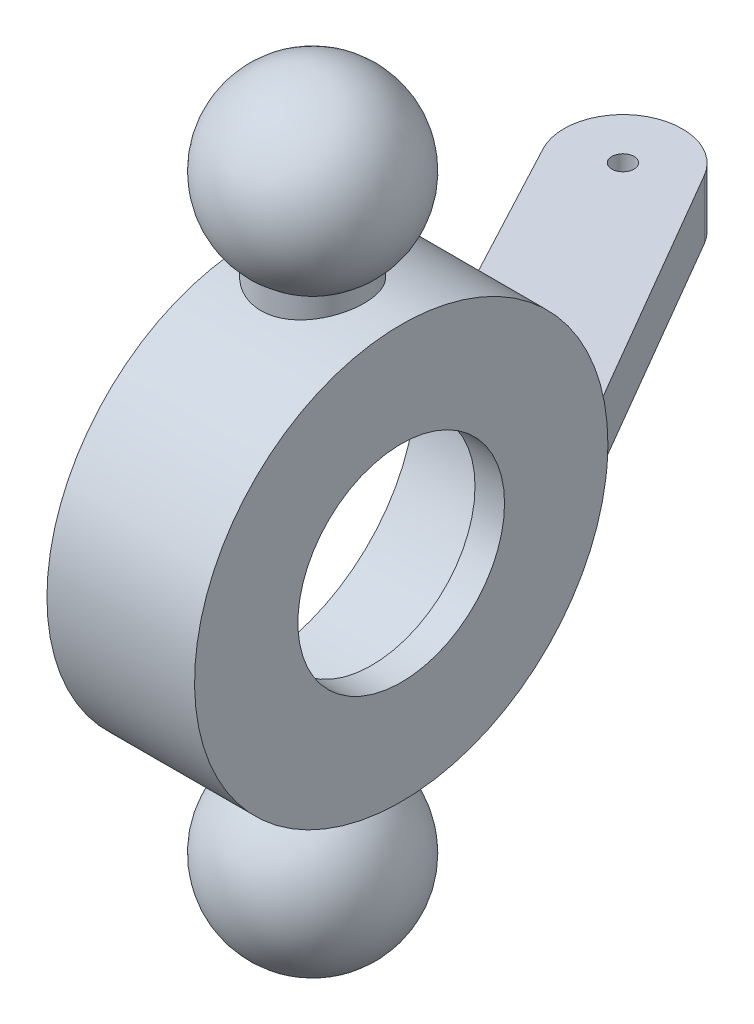
ISO-10303-21;
HEADER;
FILE_DESCRIPTION(('STEP AP214'),'2;1');
FILE_NAME('part.step','',(''),(''),'','','');
FILE_SCHEMA(('AUTOMOTIVE_DESIGN { 1 0 10303 214 1 1 1 1 }'));
ENDSEC;
DATA;
#1=APPLICATION_CONTEXT('core data for automotive mechanical design processes');
#2=APPLICATION_PROTOCOL_DEFINITION('international standard','automotive_design',2000,#1);
#3=PRODUCT_CONTEXT('',#1,'mechanical');
#4=PRODUCT('Part','Part','',(#3));
#5=PRODUCT_RELATED_PRODUCT_CATEGORY('part','',(#4));
#6=PRODUCT_DEFINITION_FORMATION('','',#4);
#7=PRODUCT_DEFINITION_CONTEXT('part definition',#1,'design');
#8=PRODUCT_DEFINITION('design','',#6,#7);
#9=PRODUCT_DEFINITION_SHAPE('','',#8);
#10=(LENGTH_UNIT() NAMED_UNIT(*) SI_UNIT(.MILLI.,.METRE.));
#11=(NAMED_UNIT(*) PLANE_ANGLE_UNIT() SI_UNIT($,.RADIAN.));
#12=(NAMED_UNIT(*) SI_UNIT($,.STERADIAN.) SOLID_ANGLE_UNIT());
#13=UNCERTAINTY_MEASURE_WITH_UNIT(LENGTH_MEASURE(1.E-05),#10,'distance_accuracy_value','');
#14=(GEOMETRIC_REPRESENTATION_CONTEXT(3) GLOBAL_UNCERTAINTY_ASSIGNED_CONTEXT((#13)) GLOBAL_UNIT_ASSIGNED_CONTEXT((#10,
#11,#12)) REPRESENTATION_CONTEXT('',''));
#15=CARTESIAN_POINT('',(0.,0.,0.));
#16=DIRECTION('',(0.,0.,1.));
#17=DIRECTION('',(1.,0.,0.));
#18=AXIS2_PLACEMENT_3D('',#15,#16,#17);
#19=CARTESIAN_POINT('',(0.,0.,0.));
#20=DIRECTION('',(1.,0.,0.));
#21=DIRECTION('',(0.,0.,-1.));
#22=AXIS2_PLACEMENT_3D('',#19,#20,#21);
#23=PLANE('',#22);
#24=CARTESIAN_POINT('',(0.,0.,0.));
#25=DIRECTION('',(1.,0.,0.));
#26=DIRECTION('',(0.,0.,-1.));
#27=AXIS2_PLACEMENT_3D('',#24,#25,#26);
#28=CIRCLE('',#27,11.);
#29=CARTESIAN_POINT('',(0.,0.,-11.));
#30=VERTEX_POINT('',#29);
#31=EDGE_CURVE('E174',#30,#30,#28,.T.);
#32=ORIENTED_EDGE('',*,*,#31,.T.);
#33=EDGE_LOOP('',(#32));
#34=FACE_BOUND('',#33,.T.);
#35=DIRECTION('',(0.,0.,1.));
#36=VECTOR('',#35,1.);
#37=CARTESIAN_POINT('',(0.,-2.,0.));
#38=LINE('',#37,#36);
#39=CARTESIAN_POINT('',(0.,-2.,-13.856406460551));
#40=VERTEX_POINT('',#39);
#41=CARTESIAN_POINT('',(0.,-2.,-13.));
#42=VERTEX_POINT('',#41);
#43=EDGE_CURVE('E157',#40,#42,#38,.T.);
#44=ORIENTED_EDGE('',*,*,#43,.F.);
#45=CARTESIAN_POINT('',(0.,0.,0.));
#46=DIRECTION('',(1.,0.,0.));
#47=DIRECTION('',(0.,0.,-1.));
#48=AXIS2_PLACEMENT_3D('',#45,#46,#47);
#49=CIRCLE('',#48,14.);
#50=CARTESIAN_POINT('',(0.,2.,-13.856406460551));
#51=VERTEX_POINT('',#50);
#52=EDGE_CURVE('E177',#51,#40,#49,.T.);
#53=ORIENTED_EDGE('',*,*,#52,.F.);
#54=DIRECTION('',(0.,0.,1.));
#55=VECTOR('',#54,1.);
#56=CARTESIAN_POINT('',(0.,2.,0.));
#57=LINE('',#56,#55);
#58=CARTESIAN_POINT('',(0.,2.,-13.));
#59=VERTEX_POINT('',#58);
#60=EDGE_CURVE('E55',#51,#59,#57,.T.);
#61=ORIENTED_EDGE('',*,*,#60,.T.);
#62=DIRECTION('',(0.,1.,0.));
#63=VECTOR('',#62,1.);
#64=CARTESIAN_POINT('',(0.,-2.,-13.));
#65=LINE('',#64,#63);
#66=EDGE_CURVE('E147',#42,#59,#65,.T.);
#67=ORIENTED_EDGE('',*,*,#66,.F.);
#68=EDGE_LOOP('',(#44,#53,#61,#67));
#69=FACE_BOUND('',#68,.T.);
#70=ADVANCED_FACE('F39',(#34,#69),#23,.F.);
#71=CARTESIAN_POINT('',(8.,0.,0.));
#72=DIRECTION('',(-1.,0.,0.));
#73=DIRECTION('',(0.,0.,1.));
#74=AXIS2_PLACEMENT_3D('',#71,#72,#73);
#75=CYLINDRICAL_SURFACE('',#74,14.);
#76=CARTESIAN_POINT('',(10.,0.,0.));
#77=DIRECTION('',(1.,0.,0.));
#78=DIRECTION('',(0.,0.,-1.));
#79=AXIS2_PLACEMENT_3D('',#76,#77,#78);
#80=CIRCLE('',#79,14.);
#81=CARTESIAN_POINT('',(10.,0.,-14.));
#82=VERTEX_POINT('',#81);
#83=EDGE_CURVE('E165',#82,#82,#80,.T.);
#84=ORIENTED_EDGE('',*,*,#83,.F.);
#85=EDGE_LOOP('',(#84));
#86=FACE_BOUND('',#85,.T.);
#87=CARTESIAN_POINT('',(4.,13.555441711726,-3.5));
#88=CARTESIAN_POINT('',(4.19327105129721,13.55544540123,-3.4999945100303));
#89=CARTESIAN_POINT('',(4.38660285814993,13.5596202842044,-3.48393674369671));
#90=CARTESIAN_POINT('',(4.76771460944291,13.5758260678959,-3.42023237564931));
#91=CARTESIAN_POINT('',(4.95549125625546,13.5878615407028,-3.37256738943895));
#92=CARTESIAN_POINT('',(5.31992495346205,13.6183421443461,-3.24728767948486));
#93=CARTESIAN_POINT('',(5.49659601753999,13.6367789976664,-3.16971161899629));
#94=CARTESIAN_POINT('',(5.83443519355584,13.6779746884026,-2.98692959776594));
#95=CARTESIAN_POINT('',(5.9956026469123,13.7007337092988,-2.88172246398496));
#96=CARTESIAN_POINT('',(6.3014063033671,13.7485700289787,-2.64419179823663));
#97=CARTESIAN_POINT('',(6.44565104049007,13.7736843667225,-2.51137164278567));
#98=CARTESIAN_POINT('',(6.71006595210447,13.8230802572141,-2.22345488974093));
#99=CARTESIAN_POINT('',(6.83023387587045,13.8473617319294,-2.06835621185243));
#100=CARTESIAN_POINT('',(7.04468565468379,13.8927658172882,-1.73760328151054));
#101=CARTESIAN_POINT('',(7.13858494342605,13.9138396236083,-1.56169240667317));
#102=CARTESIAN_POINT('',(7.29533350181432,13.9500313669638,-1.19596845800987));
#103=CARTESIAN_POINT('',(7.35818735268172,13.9651501826808,-1.00615744010872));
#104=CARTESIAN_POINT('',(7.44980696841002,13.9874666238745,-0.622102262255826));
#105=CARTESIAN_POINT('',(7.47923750205722,13.9948185138204,-0.428025807368566));
#106=CARTESIAN_POINT('',(7.50526173098577,14.0013103175022,-0.0375603469678757));
#107=CARTESIAN_POINT('',(7.50186028109343,14.000451445354,0.1588283123533));
#108=CARTESIAN_POINT('',(7.46279520964981,13.9907333293494,0.543732865103353));
#109=CARTESIAN_POINT('',(7.42784914492463,13.9820520327718,0.732326754603721));
#110=CARTESIAN_POINT('',(7.32784022193207,13.9578717113484,1.10088386594792));
#111=CARTESIAN_POINT('',(7.26277576047152,13.9423723235797,1.28084662779658));
#112=CARTESIAN_POINT('',(7.10379640103822,13.906025135811,1.62892346225627));
#113=CARTESIAN_POINT('',(7.00962613747395,13.8851302757249,1.79691578418258));
#114=CARTESIAN_POINT('',(6.79530204923684,13.8402586533409,2.1149646781919));
#115=CARTESIAN_POINT('',(6.67514370401366,13.8162813551566,2.26501812279998));
#116=CARTESIAN_POINT('',(6.40840776122619,13.767091992751,2.54720912279662));
#117=CARTESIAN_POINT('',(6.26120315071884,13.7418640732785,2.67875187676046));
#118=CARTESIAN_POINT('',(5.94656003703793,13.6936106093183,2.91541731587331));
#119=CARTESIAN_POINT('',(5.77912058869123,13.6705851677987,3.0205387661713));
#120=CARTESIAN_POINT('',(5.42759395220805,13.6292869553258,3.20175845157131));
#121=CARTESIAN_POINT('',(5.24342997763167,13.6110377709745,3.27771348436242));
#122=CARTESIAN_POINT('',(4.86438034476488,13.5816609610198,3.39739967219245));
#123=CARTESIAN_POINT('',(4.66949699044373,13.5705318115174,3.44113772292637));
#124=CARTESIAN_POINT('',(4.28005669784264,13.5569749843781,3.49416149414056));
#125=CARTESIAN_POINT('',(4.08562708931842,13.5543252457504,3.50432666348898));
#126=CARTESIAN_POINT('',(3.69784928878479,13.5574228070324,3.49232378671901));
#127=CARTESIAN_POINT('',(3.50450099887188,13.5631693339647,3.47015871698913));
#128=CARTESIAN_POINT('',(3.12764002907091,13.5821991478089,3.39489564951413));
#129=CARTESIAN_POINT('',(2.94401818280283,13.5953575834006,3.34230969559482));
#130=CARTESIAN_POINT('',(2.58819595900563,13.6276100556741,3.20826531433849));
#131=CARTESIAN_POINT('',(2.41599693732198,13.6467047954483,3.12680346679746));
#132=CARTESIAN_POINT('',(2.08418221098627,13.6891459193386,2.93547893511128));
#133=CARTESIAN_POINT('',(1.92487962393981,13.7125683605018,2.82509045536991));
#134=CARTESIAN_POINT('',(1.62673629207796,13.7608391629952,2.57971102527057));
#135=CARTESIAN_POINT('',(1.48789891668986,13.7856877581962,2.44471603181903));
#136=CARTESIAN_POINT('',(1.2310645404007,13.8347636424449,2.14991952344655));
#137=CARTESIAN_POINT('',(1.11367591243167,13.8589598288664,1.98958183386058));
#138=CARTESIAN_POINT('',(0.907489786268248,13.9033610325916,1.65095938943136));
#139=CARTESIAN_POINT('',(0.818690796748509,13.9235662580553,1.47267557135157));
#140=CARTESIAN_POINT('',(0.672975551660898,13.9575816203366,1.10445370605882));
#141=CARTESIAN_POINT('',(0.61583000186931,13.9714376203137,0.914610833597587));
#142=CARTESIAN_POINT('',(0.53435553154822,13.991394107541,0.527624161115824));
#143=CARTESIAN_POINT('',(0.510020277765346,13.9974960915079,0.330481777644342));
#144=CARTESIAN_POINT('',(0.495213436485614,14.0011959293082,-0.0597923425516314));
#145=CARTESIAN_POINT('',(0.503844018166072,13.9990192607996,-0.252888394381077));
#146=CARTESIAN_POINT('',(0.552667395530223,13.9869063760105,-0.634786237451629));
#147=CARTESIAN_POINT('',(0.592859252546092,13.9769703905009,-0.823588156233251));
#148=CARTESIAN_POINT('',(0.703182769198015,13.9504901498861,-1.19059862475671));
#149=CARTESIAN_POINT('',(0.773152086600326,13.9339817575837,-1.36885873103302));
#150=CARTESIAN_POINT('',(0.940897026568503,13.896095111978,-1.71120968564569));
#151=CARTESIAN_POINT('',(1.0386761543467,13.8747162448565,-1.87529874442972));
#152=CARTESIAN_POINT('',(1.26200331898647,13.82875373881,-2.18890674948156));
#153=CARTESIAN_POINT('',(1.3881605001634,13.8041055929583,-2.33798245904417));
#154=CARTESIAN_POINT('',(1.66347998192072,13.7546727170016,-2.61315257095726));
#155=CARTESIAN_POINT('',(1.81264810638907,13.7298879538556,-2.73924113776807));
#156=CARTESIAN_POINT('',(2.13310494966311,13.6824616545926,-2.96716709265141));
#157=CARTESIAN_POINT('',(2.30475443177839,13.6598687285651,-3.06850816795732));
#158=CARTESIAN_POINT('',(2.66319421456187,13.620038442319,-3.24074413804914));
#159=CARTESIAN_POINT('',(2.84997338132846,13.6027971881625,-3.31166118413253));
#160=CARTESIAN_POINT('',(3.19701954142306,13.5783168062758,-3.41047884999851));
#161=CARTESIAN_POINT('',(3.35562607535148,13.5698032051225,-3.44397609708907));
#162=CARTESIAN_POINT('',(3.67614104149191,13.5583643503917,-3.48873802400119));
#163=CARTESIAN_POINT('',(3.83804919085541,13.5554386201188,-3.50000460030113));
#164=CARTESIAN_POINT('',(4.,13.555441711726,-3.5));
#165=B_SPLINE_CURVE_WITH_KNOTS('',3,(#87,#88,#89,#90,#91,#92,#93,#94,#95,#96,#97,#98,#99,#100,
#101,#102,#103,#104,#105,#106,#107,#108,#109,#110,#111,#112,#113,#114,#115,#116,#117,#118,#119,
#120,#121,#122,#123,#124,#125,#126,#127,#128,#129,#130,#131,#132,#133,#134,#135,#136,#137,#138,
#139,#140,#141,#142,#143,#144,#145,#146,#147,#148,#149,#150,#151,#152,#153,#154,#155,#156,#157,
#158,#159,#160,#161,#162,#163,#164),.UNSPECIFIED.,.T.,.F.,(4,2,2,2,2,2,2,2,2,2,2,2,2,2,2,2,2,2,
2,2,2,2,2,2,2,2,2,2,2,2,2,2,2,2,2,2,2,2,4),(0.,0.579218418430591,1.15877403800013,
1.73758301803243,2.3164165745767,2.90673535870167,3.49710930071813,4.09572094957088,
4.69424423785929,5.28064251393485,5.86695408132429,6.44025567764526,7.013587794147,
7.59210023956222,8.17071339656479,8.76498653200676,9.35928743679723,9.95647004813416,
10.5535248018492,11.1348100467344,11.716041780678,12.2877636702336,12.8595533000046,
13.4425598421329,14.0256622644954,14.6233546336192,15.2210158201785,15.8142890194017,
16.4074476848313,16.9845682458891,17.5616716433825,18.1356682719407,18.7097372804377,
19.2975593522537,19.8855304420219,20.4844706821114,21.0829740992857,21.5683695806357,
22.0537236515463),.UNSPECIFIED.);
#166=CARTESIAN_POINT('',(4.,13.555441711726,-3.5));
#167=VERTEX_POINT('',#166);
#168=EDGE_CURVE('E178',#167,#167,#165,.T.);
#169=ORIENTED_EDGE('',*,*,#168,.T.);
#170=EDGE_LOOP('',(#169));
#171=FACE_BOUND('',#170,.T.);
#172=CARTESIAN_POINT('',(4.,-13.555441711726,-3.5));
#173=CARTESIAN_POINT('',(3.80672894870279,-13.55544540123,-3.4999945100303));
#174=CARTESIAN_POINT('',(3.61339714185007,-13.5596202842044,-3.48393674369671));
#175=CARTESIAN_POINT('',(3.23228539055709,-13.5758260678959,-3.42023237564931));
#176=CARTESIAN_POINT('',(3.04450874374454,-13.5878615407028,-3.37256738943895));
#177=CARTESIAN_POINT('',(2.68007504653795,-13.6183421443461,-3.24728767948486));
#178=CARTESIAN_POINT('',(2.50340398246001,-13.6367789976664,-3.16971161899629));
#179=CARTESIAN_POINT('',(2.16556480644417,-13.6779746884026,-2.98692959776594));
#180=CARTESIAN_POINT('',(2.0043973530877,-13.7007337092988,-2.88172246398496));
#181=CARTESIAN_POINT('',(1.6985936966329,-13.7485700289787,-2.64419179823663));
#182=CARTESIAN_POINT('',(1.55434895950993,-13.7736843667225,-2.51137164278567));
#183=CARTESIAN_POINT('',(1.28993404789553,-13.8230802572141,-2.22345488974093));
#184=CARTESIAN_POINT('',(1.16976612412955,-13.8473617319294,-2.06835621185243));
#185=CARTESIAN_POINT('',(0.955314345316211,-13.8927658172882,-1.73760328151054));
#186=CARTESIAN_POINT('',(0.861415056573948,-13.9138396236083,-1.56169240667317));
#187=CARTESIAN_POINT('',(0.704666498185684,-13.9500313669638,-1.19596845800987));
#188=CARTESIAN_POINT('',(0.64181264731828,-13.9651501826808,-1.00615744010872));
#189=CARTESIAN_POINT('',(0.55019303158998,-13.9874666238745,-0.622102262255827));
#190=CARTESIAN_POINT('',(0.520762497942783,-13.9948185138204,-0.428025807368567));
#191=CARTESIAN_POINT('',(0.494738269014228,-14.0013103175022,-0.0375603469678764));
#192=CARTESIAN_POINT('',(0.498139718906569,-14.000451445354,0.158828312353299));
#193=CARTESIAN_POINT('',(0.537204790350194,-13.9907333293494,0.543732865103351));
#194=CARTESIAN_POINT('',(0.572150855075371,-13.9820520327718,0.73232675460372));
#195=CARTESIAN_POINT('',(0.672159778067927,-13.9578717113484,1.10088386594791));
#196=CARTESIAN_POINT('',(0.737224239528477,-13.9423723235797,1.28084662779658));
#197=CARTESIAN_POINT('',(0.896203598961785,-13.906025135811,1.62892346225627));
#198=CARTESIAN_POINT('',(0.99037386252605,-13.8851302757249,1.79691578418258));
#199=CARTESIAN_POINT('',(1.20469795076316,-13.8402586533409,2.1149646781919));
#200=CARTESIAN_POINT('',(1.32485629598634,-13.8162813551566,2.26501812279997));
#201=CARTESIAN_POINT('',(1.59159223877381,-13.767091992751,2.54720912279662));
#202=CARTESIAN_POINT('',(1.73879684928116,-13.7418640732785,2.67875187676045));
#203=CARTESIAN_POINT('',(2.05343996296207,-13.6936106093183,2.91541731587331));
#204=CARTESIAN_POINT('',(2.22087941130877,-13.6705851677987,3.0205387661713));
#205=CARTESIAN_POINT('',(2.57240604779195,-13.6292869553258,3.20175845157131));
#206=CARTESIAN_POINT('',(2.75657002236833,-13.6110377709745,3.27771348436242));
#207=CARTESIAN_POINT('',(3.13561965523512,-13.5816609610198,3.39739967219245));
#208=CARTESIAN_POINT('',(3.33050300955627,-13.5705318115174,3.44113772292637));
#209=CARTESIAN_POINT('',(3.71994330215736,-13.5569749843781,3.49416149414056));
#210=CARTESIAN_POINT('',(3.91437291068158,-13.5543252457504,3.50432666348898));
#211=CARTESIAN_POINT('',(4.30215071121521,-13.5574228070324,3.49232378671901));
#212=CARTESIAN_POINT('',(4.49549900112812,-13.5631693339647,3.47015871698913));
#213=CARTESIAN_POINT('',(4.87235997092909,-13.5821991478089,3.39489564951413));
#214=CARTESIAN_POINT('',(5.05598181719717,-13.5953575834006,3.34230969559482));
#215=CARTESIAN_POINT('',(5.41180404099437,-13.6276100556741,3.20826531433849));
#216=CARTESIAN_POINT('',(5.58400306267802,-13.6467047954483,3.12680346679746));
#217=CARTESIAN_POINT('',(5.91581778901373,-13.6891459193386,2.93547893511128));
#218=CARTESIAN_POINT('',(6.07512037606019,-13.7125683605018,2.82509045536991));
#219=CARTESIAN_POINT('',(6.37326370792204,-13.7608391629952,2.57971102527057));
#220=CARTESIAN_POINT('',(6.51210108331014,-13.7856877581962,2.44471603181903));
#221=CARTESIAN_POINT('',(6.7689354595993,-13.8347636424449,2.14991952344655));
#222=CARTESIAN_POINT('',(6.88632408756833,-13.8589598288664,1.98958183386058));
#223=CARTESIAN_POINT('',(7.09251021373175,-13.9033610325916,1.65095938943136));
#224=CARTESIAN_POINT('',(7.18130920325149,-13.9235662580553,1.47267557135157));
#225=CARTESIAN_POINT('',(7.3270244483391,-13.9575816203366,1.10445370605882));
#226=CARTESIAN_POINT('',(7.38416999813069,-13.9714376203137,0.914610833597587));
#227=CARTESIAN_POINT('',(7.46564446845178,-13.991394107541,0.527624161115824));
#228=CARTESIAN_POINT('',(7.48997972223465,-13.9974960915079,0.330481777644341));
#229=CARTESIAN_POINT('',(7.50478656351439,-14.0011959293082,-0.0597923425516321));
#230=CARTESIAN_POINT('',(7.49615598183393,-13.9990192607996,-0.252888394381078));
#231=CARTESIAN_POINT('',(7.44733260446978,-13.9869063760105,-0.63478623745163));
#232=CARTESIAN_POINT('',(7.40714074745391,-13.9769703905009,-0.823588156233251));
#233=CARTESIAN_POINT('',(7.29681723080198,-13.9504901498861,-1.19059862475671));
#234=CARTESIAN_POINT('',(7.22684791339967,-13.9339817575837,-1.36885873103302));
#235=CARTESIAN_POINT('',(7.0591029734315,-13.896095111978,-1.71120968564569));
#236=CARTESIAN_POINT('',(6.9613238456533,-13.8747162448565,-1.87529874442972));
#237=CARTESIAN_POINT('',(6.73799668101353,-13.82875373881,-2.18890674948156));
#238=CARTESIAN_POINT('',(6.61183949983659,-13.8041055929583,-2.33798245904417));
#239=CARTESIAN_POINT('',(6.33652001807928,-13.7546727170016,-2.61315257095726));
#240=CARTESIAN_POINT('',(6.18735189361093,-13.7298879538556,-2.73924113776807));
#241=CARTESIAN_POINT('',(5.86689505033689,-13.6824616545926,-2.96716709265141));
#242=CARTESIAN_POINT('',(5.69524556822161,-13.6598687285651,-3.06850816795733));
#243=CARTESIAN_POINT('',(5.33680578543813,-13.620038442319,-3.24074413804914));
#244=CARTESIAN_POINT('',(5.15002661867154,-13.6027971881625,-3.31166118413253));
#245=CARTESIAN_POINT('',(4.80298045857694,-13.5783168062758,-3.41047884999851));
#246=CARTESIAN_POINT('',(4.64437392464852,-13.5698032051225,-3.44397609708907));
#247=CARTESIAN_POINT('',(4.32385895850809,-13.5583643503917,-3.48873802400119));
#248=CARTESIAN_POINT('',(4.16195080914459,-13.5554386201188,-3.50000460030113));
#249=CARTESIAN_POINT('',(4.,-13.555441711726,-3.5));
#250=B_SPLINE_CURVE_WITH_KNOTS('',3,(#172,#173,#174,#175,#176,#177,#178,#179,#180,#181,#182,
#183,#184,#185,#186,#187,#188,#189,#190,#191,#192,#193,#194,#195,#196,#197,#198,#199,#200,#201,
#202,#203,#204,#205,#206,#207,#208,#209,#210,#211,#212,#213,#214,#215,#216,#217,#218,#219,#220,
#221,#222,#223,#224,#225,#226,#227,#228,#229,#230,#231,#232,#233,#234,#235,#236,#237,#238,#239,
#240,#241,#242,#243,#244,#245,#246,#247,#248,#249),.UNSPECIFIED.,.T.,.F.,(4,2,2,2,2,2,2,2,2,2,2,
2,2,2,2,2,2,2,2,2,2,2,2,2,2,2,2,2,2,2,2,2,2,2,2,2,2,2,4),(0.,0.579218418430591,1.15877403800013,
1.73758301803243,2.3164165745767,2.90673535870167,3.49710930071813,4.09572094957088,
4.69424423785929,5.28064251393485,5.86695408132429,6.44025567764526,7.013587794147,
7.59210023956222,8.17071339656479,8.76498653200676,9.35928743679723,9.95647004813416,
10.5535248018492,11.1348100467344,11.716041780678,12.2877636702336,12.8595533000046,
13.4425598421329,14.0256622644954,14.6233546336192,15.2210158201785,15.8142890194018,
16.4074476848313,16.9845682458891,17.5616716433825,18.1356682719407,18.7097372804378,
19.2975593522537,19.8855304420219,20.4844706821114,21.0829740992857,21.5683695806357,
22.0537236515463),.UNSPECIFIED.);
#251=CARTESIAN_POINT('',(4.,-13.555441711726,-3.5));
#252=VERTEX_POINT('',#251);
#253=EDGE_CURVE('E173',#252,#252,#250,.T.);
#254=ORIENTED_EDGE('',*,*,#253,.T.);
#255=EDGE_LOOP('',(#254));
#256=FACE_BOUND('',#255,.T.);
#257=DIRECTION('',(-1.,0.,0.));
#258=VECTOR('',#257,1.);
#259=CARTESIAN_POINT('',(8.,-2.,-13.856406460551));
#260=LINE('',#259,#258);
#261=CARTESIAN_POINT('',(9.50182028456165,-2.,-13.856406460551));
#262=VERTEX_POINT('',#261);
#263=EDGE_CURVE('E63',#262,#40,#260,.T.);
#264=ORIENTED_EDGE('',*,*,#263,.F.);
#265=CARTESIAN_POINT('',(17.5622226115993,0.,0.));
#266=DIRECTION('',(0.864389195397262,0.,-0.502823347588866));
#267=DIRECTION('',(-0.502823347588866,0.,-0.864389195397262));
#268=AXIS2_PLACEMENT_3D('',#265,#266,#267);
#269=ELLIPSE('',#268,16.1964079080903,14.);
#270=CARTESIAN_POINT('',(9.50182028456165,2.,-13.856406460551));
#271=VERTEX_POINT('',#270);
#272=EDGE_CURVE('E159',#262,#271,#269,.T.);
#273=ORIENTED_EDGE('',*,*,#272,.T.);
#274=DIRECTION('',(-1.,0.,0.));
#275=VECTOR('',#274,1.);
#276=CARTESIAN_POINT('',(8.,2.,-13.856406460551));
#277=LINE('',#276,#275);
#278=EDGE_CURVE('E107',#271,#51,#277,.T.);
#279=ORIENTED_EDGE('',*,*,#278,.T.);
#280=ORIENTED_EDGE('',*,*,#52,.T.);
#281=EDGE_LOOP('',(#264,#273,#279,#280));
#282=FACE_BOUND('',#281,.T.);
#283=ADVANCED_FACE('F41',(#86,#171,#256,#282),#75,.T.);
#284=CARTESIAN_POINT('',(8.,0.,0.));
#285=DIRECTION('',(-1.,0.,0.));
#286=DIRECTION('',(0.,0.,1.));
#287=AXIS2_PLACEMENT_3D('',#284,#285,#286);
#288=CYLINDRICAL_SURFACE('',#287,11.);
#289=CARTESIAN_POINT('',(8.,0.,0.));
#290=DIRECTION('',(1.,0.,0.));
#291=DIRECTION('',(0.,0.,-1.));
#292=AXIS2_PLACEMENT_3D('',#289,#290,#291);
#293=CIRCLE('',#292,11.);
#294=CARTESIAN_POINT('',(8.,0.,-11.));
#295=VERTEX_POINT('',#294);
#296=EDGE_CURVE('E170',#295,#295,#293,.T.);
#297=ORIENTED_EDGE('',*,*,#296,.T.);
#298=EDGE_LOOP('',(#297));
#299=FACE_BOUND('',#298,.T.);
#300=ORIENTED_EDGE('',*,*,#31,.F.);
#301=EDGE_LOOP('',(#300));
#302=FACE_BOUND('',#301,.T.);
#303=ADVANCED_FACE('F193',(#299,#302),#288,.F.);
#304=CARTESIAN_POINT('',(4.,12.,0.));
#305=DIRECTION('',(0.,-1.,0.));
#306=DIRECTION('',(0.,0.,-1.));
#307=AXIS2_PLACEMENT_3D('',#304,#305,#306);
#308=CYLINDRICAL_SURFACE('',#307,3.5);
#309=CARTESIAN_POINT('',(4.,15.1266028275955,0.));
#310=DIRECTION('',(0.,1.,0.));
#311=DIRECTION('',(0.,0.,1.));
#312=AXIS2_PLACEMENT_3D('',#309,#310,#311);
#313=CIRCLE('',#312,3.5);
#314=CARTESIAN_POINT('',(4.,15.1266028275955,3.5));
#315=VERTEX_POINT('',#314);
#316=EDGE_CURVE('E48',#315,#315,#313,.T.);
#317=ORIENTED_EDGE('',*,*,#316,.F.);
#318=EDGE_LOOP('',(#317));
#319=FACE_BOUND('',#318,.T.);
#320=ORIENTED_EDGE('',*,*,#168,.F.);
#321=EDGE_LOOP('',(#320));
#322=FACE_BOUND('',#321,.T.);
#323=ADVANCED_FACE('F187',(#319,#322),#308,.T.);
#324=CARTESIAN_POINT('',(4.,20.,0.));
#325=DIRECTION('',(0.,-1.,0.));
#326=DIRECTION('',(0.,0.,1.));
#327=AXIS2_PLACEMENT_3D('',#324,#325,#326);
#328=SPHERICAL_SURFACE('',#327,6.);
#329=ORIENTED_EDGE('',*,*,#316,.T.);
#330=EDGE_LOOP('',(#329));
#331=FACE_BOUND('',#330,.T.);
#332=ADVANCED_FACE('F192',(#331),#328,.T.);
#333=CARTESIAN_POINT('',(4.,-12.,0.));
#334=DIRECTION('',(0.,1.,0.));
#335=DIRECTION('',(0.,0.,-1.));
#336=AXIS2_PLACEMENT_3D('',#333,#334,#335);
#337=CYLINDRICAL_SURFACE('',#336,3.5);
#338=CARTESIAN_POINT('',(4.,-15.1266028275955,0.));
#339=DIRECTION('',(0.,-1.,0.));
#340=DIRECTION('',(0.,0.,-1.));
#341=AXIS2_PLACEMENT_3D('',#338,#339,#340);
#342=CIRCLE('',#341,3.5);
#343=CARTESIAN_POINT('',(4.,-15.1266028275955,-3.5));
#344=VERTEX_POINT('',#343);
#345=EDGE_CURVE('E11',#344,#344,#342,.T.);
#346=ORIENTED_EDGE('',*,*,#345,.F.);
#347=EDGE_LOOP('',(#346));
#348=FACE_BOUND('',#347,.T.);
#349=ORIENTED_EDGE('',*,*,#253,.F.);
#350=EDGE_LOOP('',(#349));
#351=FACE_BOUND('',#350,.T.);
#352=ADVANCED_FACE('F254',(#348,#351),#337,.T.);
#353=CARTESIAN_POINT('',(4.,-20.,0.));
#354=DIRECTION('',(0.,1.,0.));
#355=DIRECTION('',(0.,0.,1.));
#356=AXIS2_PLACEMENT_3D('',#353,#354,#355);
#357=SPHERICAL_SURFACE('',#356,6.);
#358=ORIENTED_EDGE('',*,*,#345,.T.);
#359=EDGE_LOOP('',(#358));
#360=FACE_BOUND('',#359,.T.);
#361=ADVANCED_FACE('F251',(#360),#357,.T.);
#362=CARTESIAN_POINT('',(8.,0.,0.));
#363=DIRECTION('',(1.,0.,0.));
#364=DIRECTION('',(0.,0.,-1.));
#365=AXIS2_PLACEMENT_3D('',#362,#363,#364);
#366=PLANE('',#365);
#367=CARTESIAN_POINT('',(8.,0.,0.));
#368=DIRECTION('',(1.,0.,0.));
#369=DIRECTION('',(0.,0.,-1.));
#370=AXIS2_PLACEMENT_3D('',#367,#368,#369);
#371=CIRCLE('',#370,7.);
#372=CARTESIAN_POINT('',(8.,0.,-7.));
#373=VERTEX_POINT('',#372);
#374=EDGE_CURVE('E161',#373,#373,#371,.T.);
#375=ORIENTED_EDGE('',*,*,#374,.T.);
#376=EDGE_LOOP('',(#375));
#377=FACE_BOUND('',#376,.T.);
#378=ORIENTED_EDGE('',*,*,#296,.F.);
#379=EDGE_LOOP('',(#378));
#380=FACE_BOUND('',#379,.T.);
#381=ADVANCED_FACE('F247',(#377,#380),#366,.F.);
#382=CARTESIAN_POINT('',(10.,0.,0.));
#383=DIRECTION('',(1.,0.,0.));
#384=DIRECTION('',(0.,0.,-1.));
#385=AXIS2_PLACEMENT_3D('',#382,#383,#384);
#386=PLANE('',#385);
#387=ORIENTED_EDGE('',*,*,#83,.T.);
#388=EDGE_LOOP('',(#387));
#389=FACE_BOUND('',#388,.T.);
#390=CARTESIAN_POINT('',(10.,0.,0.));
#391=DIRECTION('',(1.,0.,0.));
#392=DIRECTION('',(0.,0.,-1.));
#393=AXIS2_PLACEMENT_3D('',#390,#391,#392);
#394=CIRCLE('',#393,7.);
#395=CARTESIAN_POINT('',(10.,0.,-7.));
#396=VERTEX_POINT('',#395);
#397=EDGE_CURVE('E162',#396,#396,#394,.T.);
#398=ORIENTED_EDGE('',*,*,#397,.F.);
#399=EDGE_LOOP('',(#398));
#400=FACE_BOUND('',#399,.T.);
#401=ADVANCED_FACE('F243',(#389,#400),#386,.T.);
#402=CARTESIAN_POINT('',(10.,0.,0.));
#403=DIRECTION('',(-1.,0.,0.));
#404=DIRECTION('',(0.,0.,1.));
#405=AXIS2_PLACEMENT_3D('',#402,#403,#404);
#406=CYLINDRICAL_SURFACE('',#405,7.);
#407=ORIENTED_EDGE('',*,*,#397,.T.);
#408=EDGE_LOOP('',(#407));
#409=FACE_BOUND('',#408,.T.);
#410=ORIENTED_EDGE('',*,*,#374,.F.);
#411=EDGE_LOOP('',(#410));
#412=FACE_BOUND('',#411,.T.);
#413=ADVANCED_FACE('F240',(#409,#412),#406,.F.);
#414=CARTESIAN_POINT('',(10.,-2.,-13.));
#415=DIRECTION('',(0.864389195397262,0.,-0.502823347588866));
#416=DIRECTION('',(-0.502823347588866,0.,-0.864389195397262));
#417=AXIS2_PLACEMENT_3D('',#414,#415,#416);
#418=PLANE('',#417);
#419=ORIENTED_EDGE('',*,*,#272,.F.);
#420=DIRECTION('',(-0.502823347588866,0.,-0.864389195397262));
#421=VECTOR('',#420,1.);
#422=CARTESIAN_POINT('',(10.,-2.,-13.));
#423=LINE('',#422,#421);
#424=CARTESIAN_POINT('',(-0.477339241591873,-2.,-31.0112933903555));
#425=VERTEX_POINT('',#424);
#426=EDGE_CURVE('E115',#262,#425,#423,.T.);
#427=ORIENTED_EDGE('',*,*,#426,.T.);
#428=DIRECTION('',(0.,1.,0.));
#429=VECTOR('',#428,1.);
#430=CARTESIAN_POINT('',(-0.477339241591873,-2.,-31.0112933903555));
#431=LINE('',#430,#429);
#432=CARTESIAN_POINT('',(-0.477339241591873,2.,-31.0112933903555));
#433=VERTEX_POINT('',#432);
#434=EDGE_CURVE('E113',#425,#433,#431,.T.);
#435=ORIENTED_EDGE('',*,*,#434,.T.);
#436=DIRECTION('',(-0.502823347588866,0.,-0.864389195397262));
#437=VECTOR('',#436,1.);
#438=CARTESIAN_POINT('',(10.,2.,-13.));
#439=LINE('',#438,#437);
#440=EDGE_CURVE('E100',#271,#433,#439,.T.);
#441=ORIENTED_EDGE('',*,*,#440,.F.);
#442=EDGE_LOOP('',(#419,#427,#435,#441));
#443=FACE_BOUND('',#442,.T.);
#444=ADVANCED_FACE('F114',(#443),#418,.T.);
#445=CARTESIAN_POINT('',(-3.93489602318092,-2.,-29.));
#446=DIRECTION('',(0.,1.,0.));
#447=DIRECTION('',(0.,0.,1.));
#448=AXIS2_PLACEMENT_3D('',#445,#446,#447);
#449=PLANE('',#448);
#450=CARTESIAN_POINT('',(-3.97707070382753,-2.,-29.));
#451=DIRECTION('',(0.,1.,0.));
#452=DIRECTION('',(0.,0.,1.));
#453=AXIS2_PLACEMENT_3D('',#450,#451,#452);
#454=CIRCLE('',#453,0.75);
#455=CARTESIAN_POINT('',(-3.97707070382753,-2.,-28.25));
#456=VERTEX_POINT('',#455);
#457=EDGE_CURVE('E133',#456,#456,#454,.T.);
#458=ORIENTED_EDGE('',*,*,#457,.T.);
#459=EDGE_LOOP('',(#458));
#460=FACE_BOUND('',#459,.T.);
#461=ORIENTED_EDGE('',*,*,#263,.T.);
#462=ORIENTED_EDGE('',*,*,#43,.T.);
#463=DIRECTION('',(0.469471562785892,0.,0.882947592858926));
#464=VECTOR('',#463,1.);
#465=CARTESIAN_POINT('',(-7.50886107526324,-2.,-27.1221137488564));
#466=LINE('',#465,#464);
#467=CARTESIAN_POINT('',(-7.50886107526324,-2.,-27.1221137488564));
#468=VERTEX_POINT('',#467);
#469=EDGE_CURVE('E120',#468,#42,#466,.T.);
#470=ORIENTED_EDGE('',*,*,#469,.F.);
#471=CARTESIAN_POINT('',(-3.97707070382753,-2.,-29.));
#472=DIRECTION('',(0.,1.,0.));
#473=DIRECTION('',(0.,0.,1.));
#474=AXIS2_PLACEMENT_3D('',#471,#472,#473);
#475=CIRCLE('',#474,4.);
#476=CARTESIAN_POINT('',(-3.97707070382753,-2.,-33.));
#477=VERTEX_POINT('',#476);
#478=EDGE_CURVE('E142',#477,#468,#475,.T.);
#479=ORIENTED_EDGE('',*,*,#478,.F.);
#480=DIRECTION('',(-1.,0.,-3.29054958924222E-13));
#481=VECTOR('',#480,1.);
#482=CARTESIAN_POINT('',(-3.93489602318092,-2.,-33.));
#483=LINE('',#482,#481);
#484=CARTESIAN_POINT('',(-3.93489602318092,-2.,-33.));
#485=VERTEX_POINT('',#484);
#486=EDGE_CURVE('E139',#485,#477,#483,.T.);
#487=ORIENTED_EDGE('',*,*,#486,.F.);
#488=CARTESIAN_POINT('',(-3.93489602318092,-2.,-29.));
#489=DIRECTION('',(0.,1.,0.));
#490=DIRECTION('',(0.,0.,1.));
#491=AXIS2_PLACEMENT_3D('',#488,#489,#490);
#492=CIRCLE('',#491,4.);
#493=EDGE_CURVE('E137',#425,#485,#492,.T.);
#494=ORIENTED_EDGE('',*,*,#493,.F.);
#495=ORIENTED_EDGE('',*,*,#426,.F.);
#496=EDGE_LOOP('',(#461,#462,#470,#479,#487,#494,#495));
#497=FACE_BOUND('',#496,.T.);
#498=ADVANCED_FACE('F210',(#460,#497),#449,.F.);
#499=CARTESIAN_POINT('',(-3.93489602318092,2.,-29.));
#500=DIRECTION('',(0.,1.,0.));
#501=DIRECTION('',(0.,0.,1.));
#502=AXIS2_PLACEMENT_3D('',#499,#500,#501);
#503=PLANE('',#502);
#504=CARTESIAN_POINT('',(-3.97707070382753,2.,-29.));
#505=DIRECTION('',(0.,1.,0.));
#506=DIRECTION('',(0.,0.,1.));
#507=AXIS2_PLACEMENT_3D('',#504,#505,#506);
#508=CIRCLE('',#507,0.75);
#509=CARTESIAN_POINT('',(-3.97707070382753,2.,-28.25));
#510=VERTEX_POINT('',#509);
#511=EDGE_CURVE('E110',#510,#510,#508,.T.);
#512=ORIENTED_EDGE('',*,*,#511,.F.);
#513=EDGE_LOOP('',(#512));
#514=FACE_BOUND('',#513,.T.);
#515=ORIENTED_EDGE('',*,*,#60,.F.);
#516=ORIENTED_EDGE('',*,*,#278,.F.);
#517=ORIENTED_EDGE('',*,*,#440,.T.);
#518=CARTESIAN_POINT('',(-3.93489602318092,2.,-29.));
#519=DIRECTION('',(0.,1.,0.));
#520=DIRECTION('',(0.,0.,1.));
#521=AXIS2_PLACEMENT_3D('',#518,#519,#520);
#522=CIRCLE('',#521,4.);
#523=CARTESIAN_POINT('',(-3.93489602318092,2.,-33.));
#524=VERTEX_POINT('',#523);
#525=EDGE_CURVE('E105',#433,#524,#522,.T.);
#526=ORIENTED_EDGE('',*,*,#525,.T.);
#527=DIRECTION('',(-1.,0.,-3.29054958924222E-13));
#528=VECTOR('',#527,1.);
#529=CARTESIAN_POINT('',(-3.93489602318092,2.,-33.));
#530=LINE('',#529,#528);
#531=CARTESIAN_POINT('',(-3.97707070382753,2.,-33.));
#532=VERTEX_POINT('',#531);
#533=EDGE_CURVE('E123',#524,#532,#530,.T.);
#534=ORIENTED_EDGE('',*,*,#533,.T.);
#535=CARTESIAN_POINT('',(-3.97707070382753,2.,-29.));
#536=DIRECTION('',(0.,1.,0.));
#537=DIRECTION('',(0.,0.,1.));
#538=AXIS2_PLACEMENT_3D('',#535,#536,#537);
#539=CIRCLE('',#538,4.);
#540=CARTESIAN_POINT('',(-7.50886107526324,2.,-27.1221137488564));
#541=VERTEX_POINT('',#540);
#542=EDGE_CURVE('E125',#532,#541,#539,.T.);
#543=ORIENTED_EDGE('',*,*,#542,.T.);
#544=DIRECTION('',(0.469471562785892,0.,0.882947592858926));
#545=VECTOR('',#544,1.);
#546=CARTESIAN_POINT('',(-7.50886107526324,2.,-27.1221137488564));
#547=LINE('',#546,#545);
#548=EDGE_CURVE('E131',#541,#59,#547,.T.);
#549=ORIENTED_EDGE('',*,*,#548,.T.);
#550=EDGE_LOOP('',(#515,#516,#517,#526,#534,#543,#549));
#551=FACE_BOUND('',#550,.T.);
#552=ADVANCED_FACE('F102',(#514,#551),#503,.T.);
#553=CARTESIAN_POINT('',(-7.50886107526324,-2.,-27.1221137488564));
#554=DIRECTION('',(-0.882947592858926,0.,0.469471562785892));
#555=DIRECTION('',(0.469471562785892,0.,0.882947592858926));
#556=AXIS2_PLACEMENT_3D('',#553,#554,#555);
#557=PLANE('',#556);
#558=ORIENTED_EDGE('',*,*,#66,.T.);
#559=ORIENTED_EDGE('',*,*,#548,.F.);
#560=DIRECTION('',(0.,1.,0.));
#561=VECTOR('',#560,1.);
#562=CARTESIAN_POINT('',(-7.50886107526324,-2.,-27.1221137488564));
#563=LINE('',#562,#561);
#564=EDGE_CURVE('E149',#468,#541,#563,.T.);
#565=ORIENTED_EDGE('',*,*,#564,.F.);
#566=ORIENTED_EDGE('',*,*,#469,.T.);
#567=EDGE_LOOP('',(#558,#559,#565,#566));
#568=FACE_BOUND('',#567,.T.);
#569=ADVANCED_FACE('F220',(#568),#557,.T.);
#570=CARTESIAN_POINT('',(-3.97707070382753,-2.,-29.));
#571=DIRECTION('',(0.,1.,0.));
#572=DIRECTION('',(0.,0.,1.));
#573=AXIS2_PLACEMENT_3D('',#570,#571,#572);
#574=CYLINDRICAL_SURFACE('',#573,4.);
#575=ORIENTED_EDGE('',*,*,#564,.T.);
#576=ORIENTED_EDGE('',*,*,#542,.F.);
#577=DIRECTION('',(0.,1.,0.));
#578=VECTOR('',#577,1.);
#579=CARTESIAN_POINT('',(-3.97707070382753,-2.,-33.));
#580=LINE('',#579,#578);
#581=EDGE_CURVE('E151',#477,#532,#580,.T.);
#582=ORIENTED_EDGE('',*,*,#581,.F.);
#583=ORIENTED_EDGE('',*,*,#478,.T.);
#584=EDGE_LOOP('',(#575,#576,#582,#583));
#585=FACE_BOUND('',#584,.T.);
#586=ADVANCED_FACE('F218',(#585),#574,.T.);
#587=CARTESIAN_POINT('',(-3.93489602318092,-2.,-33.));
#588=DIRECTION('',(3.29054958924222E-13,0.,-1.));
#589=DIRECTION('',(-1.,0.,-3.29054958924222E-13));
#590=AXIS2_PLACEMENT_3D('',#587,#588,#589);
#591=PLANE('',#590);
#592=ORIENTED_EDGE('',*,*,#581,.T.);
#593=ORIENTED_EDGE('',*,*,#533,.F.);
#594=DIRECTION('',(0.,1.,0.));
#595=VECTOR('',#594,1.);
#596=CARTESIAN_POINT('',(-3.93489602318092,-2.,-33.));
#597=LINE('',#596,#595);
#598=EDGE_CURVE('E119',#485,#524,#597,.T.);
#599=ORIENTED_EDGE('',*,*,#598,.F.);
#600=ORIENTED_EDGE('',*,*,#486,.T.);
#601=EDGE_LOOP('',(#592,#593,#599,#600));
#602=FACE_BOUND('',#601,.T.);
#603=ADVANCED_FACE('F214',(#602),#591,.T.);
#604=CARTESIAN_POINT('',(-3.93489602318092,-2.,-29.));
#605=DIRECTION('',(0.,1.,0.));
#606=DIRECTION('',(0.,0.,1.));
#607=AXIS2_PLACEMENT_3D('',#604,#605,#606);
#608=CYLINDRICAL_SURFACE('',#607,4.);
#609=ORIENTED_EDGE('',*,*,#598,.T.);
#610=ORIENTED_EDGE('',*,*,#525,.F.);
#611=ORIENTED_EDGE('',*,*,#434,.F.);
#612=ORIENTED_EDGE('',*,*,#493,.T.);
#613=EDGE_LOOP('',(#609,#610,#611,#612));
#614=FACE_BOUND('',#613,.T.);
#615=ADVANCED_FACE('F122',(#614),#608,.T.);
#616=CARTESIAN_POINT('',(-3.97707070382753,-2.,-29.));
#617=DIRECTION('',(0.,1.,0.));
#618=DIRECTION('',(0.,0.,1.));
#619=AXIS2_PLACEMENT_3D('',#616,#617,#618);
#620=CYLINDRICAL_SURFACE('',#619,0.75);
#621=ORIENTED_EDGE('',*,*,#457,.F.);
#622=EDGE_LOOP('',(#621));
#623=FACE_BOUND('',#622,.T.);
#624=ORIENTED_EDGE('',*,*,#511,.T.);
#625=EDGE_LOOP('',(#624));
#626=FACE_BOUND('',#625,.T.);
#627=ADVANCED_FACE('F237',(#623,#626),#620,.F.);
#628=CLOSED_SHELL('',(#70,#283,#303,#323,#332,#352,#361,#381,#401,#413,#444,#498,#552,#569,#586,
#603,#615,#627));
#629=MANIFOLD_SOLID_BREP('B2',#628);
#630=ADVANCED_BREP_SHAPE_REPRESENTATION('',(#18,#629),#14);
#631=SHAPE_DEFINITION_REPRESENTATION(#9,#630);
ENDSEC;
END-ISO-10303-21;
